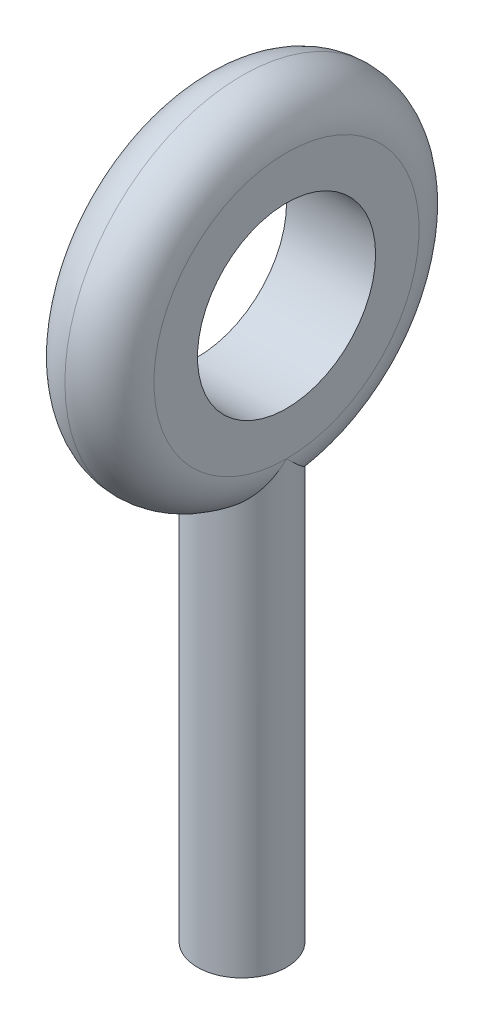
ISO-10303-21;
HEADER;
FILE_DESCRIPTION(('STEP AP214'),'2;1');
FILE_NAME('part.step','',(''),(''),'','','');
FILE_SCHEMA(('AUTOMOTIVE_DESIGN { 1 0 10303 214 1 1 1 1 }'));
ENDSEC;
DATA;
#1=APPLICATION_CONTEXT('core data for automotive mechanical design processes');
#2=APPLICATION_PROTOCOL_DEFINITION('international standard','automotive_design',2000,#1);
#3=PRODUCT_CONTEXT('',#1,'mechanical');
#4=PRODUCT('Part','Part','',(#3));
#5=PRODUCT_RELATED_PRODUCT_CATEGORY('part','',(#4));
#6=PRODUCT_DEFINITION_FORMATION('','',#4);
#7=PRODUCT_DEFINITION_CONTEXT('part definition',#1,'design');
#8=PRODUCT_DEFINITION('design','',#6,#7);
#9=PRODUCT_DEFINITION_SHAPE('','',#8);
#10=(LENGTH_UNIT() NAMED_UNIT(*) SI_UNIT(.MILLI.,.METRE.));
#11=(NAMED_UNIT(*) PLANE_ANGLE_UNIT() SI_UNIT($,.RADIAN.));
#12=(NAMED_UNIT(*) SI_UNIT($,.STERADIAN.) SOLID_ANGLE_UNIT());
#13=UNCERTAINTY_MEASURE_WITH_UNIT(LENGTH_MEASURE(1.E-05),#10,'distance_accuracy_value','');
#14=(GEOMETRIC_REPRESENTATION_CONTEXT(3) GLOBAL_UNCERTAINTY_ASSIGNED_CONTEXT((#13)) GLOBAL_UNIT_ASSIGNED_CONTEXT((#10,
#11,#12)) REPRESENTATION_CONTEXT('',''));
#15=CARTESIAN_POINT('',(0.,0.,0.));
#16=DIRECTION('',(0.,0.,1.));
#17=DIRECTION('',(1.,0.,0.));
#18=AXIS2_PLACEMENT_3D('',#15,#16,#17);
#19=CARTESIAN_POINT('',(3.175,-66.2523069570991,0.));
#20=DIRECTION('',(0.,1.,0.));
#21=DIRECTION('',(0.,0.,1.));
#22=AXIS2_PLACEMENT_3D('',#19,#20,#21);
#23=CYLINDRICAL_SURFACE('',#22,3.175);
#24=CARTESIAN_POINT('',(3.175,-12.2203304017109,3.175));
#25=CARTESIAN_POINT('',(3.25058717877362,-12.2203401520479,3.17501546389478));
#26=CARTESIAN_POINT('',(3.32616511915467,-12.2182431327259,3.17230120144131));
#27=CARTESIAN_POINT('',(3.47667643630509,-12.2099107567217,3.16153133110369));
#28=CARTESIAN_POINT('',(3.55161009033232,-12.2036772807421,3.15347815064083));
#29=CARTESIAN_POINT('',(3.69986312826365,-12.1871930320757,3.13220766395765));
#30=CARTESIAN_POINT('',(3.77318917197463,-12.1769647931453,3.11901932551284));
#31=CARTESIAN_POINT('',(3.91810714464931,-12.1526359234494,3.08770478565967));
#32=CARTESIAN_POINT('',(3.98969895719154,-12.1385350334868,3.06957825373793));
#33=CARTESIAN_POINT('',(4.20092733208115,-12.0907153354785,3.00824057276393));
#34=CARTESIAN_POINT('',(4.33736776169311,-12.051439539428,2.95801934192664));
#35=CARTESIAN_POINT('',(4.59851726014337,-11.9597989942898,2.84160985498486));
#36=CARTESIAN_POINT('',(4.72321279246199,-11.9074193905445,2.77540348089231));
#37=CARTESIAN_POINT('',(4.96660021044291,-11.7877430096744,2.62535814323807));
#38=CARTESIAN_POINT('',(5.084395182898,-11.7197053605964,2.54066107273756));
#39=CARTESIAN_POINT('',(5.30361244004525,-11.5731433082763,2.3600525972756));
#40=CARTESIAN_POINT('',(5.40502754858314,-11.4946143360787,2.26413630863961));
#41=CARTESIAN_POINT('',(5.63611071797704,-11.2891484066768,2.01605137987444));
#42=CARTESIAN_POINT('',(5.75598139164765,-11.1570658669725,1.85897697258496));
#43=CARTESIAN_POINT('',(5.96107985253833,-10.8789298892148,1.5347163236911));
#44=CARTESIAN_POINT('',(6.04622595753829,-10.7328444970927,1.36750729072541));
#45=CARTESIAN_POINT('',(6.19568207391777,-10.405311267525,1.00079433532972));
#46=CARTESIAN_POINT('',(6.25412977153179,-10.222034273568,0.800564308557489));
#47=CARTESIAN_POINT('',(6.33100184410796,-9.84642255570457,0.401780864382179));
#48=CARTESIAN_POINT('',(6.34950000010262,-9.654105200682,0.203225031998789));
#49=CARTESIAN_POINT('',(6.34999666457812,-9.45636032807791,0.00531296478064225));
#50=CARTESIAN_POINT('',(6.34999999772981,-9.4537046565621,0.0026561733122218));
#51=CARTESIAN_POINT('',(6.35,-9.45104847634363,0.));
#52=B_SPLINE_CURVE_WITH_KNOTS('',3,(#24,#25,#26,#27,#28,#29,#30,#31,#32,#33,#34,#35,#36,#37,#38,
#39,#40,#41,#42,#43,#44,#45,#46,#47,#48,#49,#50,#51),.UNSPECIFIED.,.F.,.F.,(4,2,2,2,2,2,2,2,2,2,
2,2,2,4),(0.,0.226668473055774,0.453233958413536,0.678539468695532,0.903860062384818,
1.3534441832624,1.80354028684649,2.28248200752316,2.76163299068898,3.47072626153887,
4.18147803519401,5.01104138546582,5.83907133719956,5.85034076955983),.UNSPECIFIED.);
#53=CARTESIAN_POINT('',(6.35,-9.45104847634363,0.));
#54=VERTEX_POINT('',#53);
#55=CARTESIAN_POINT('',(3.175,-12.2203304017109,3.175));
#56=VERTEX_POINT('',#55);
#57=EDGE_CURVE('E80',#54,#56,#52,.F.);
#58=ORIENTED_EDGE('',*,*,#57,.T.);
#59=CARTESIAN_POINT('',(3.175,-12.2203304017109,3.175));
#60=CARTESIAN_POINT('',(3.09941282122638,-12.2203401520479,3.17501546389478));
#61=CARTESIAN_POINT('',(3.02383488084533,-12.2182431327259,3.17230120144131));
#62=CARTESIAN_POINT('',(2.87332356369491,-12.2099107567217,3.16153133110369));
#63=CARTESIAN_POINT('',(2.79838990966768,-12.2036772807421,3.15347815064083));
#64=CARTESIAN_POINT('',(2.65013687173635,-12.1871930320757,3.13220766395765));
#65=CARTESIAN_POINT('',(2.57681082802537,-12.1769647931453,3.11901932551284));
#66=CARTESIAN_POINT('',(2.43189285535069,-12.1526359234494,3.08770478565967));
#67=CARTESIAN_POINT('',(2.36030104280846,-12.1385350334868,3.06957825373793));
#68=CARTESIAN_POINT('',(2.14907266791885,-12.0907153354785,3.00824057276393));
#69=CARTESIAN_POINT('',(2.01263223830689,-12.051439539428,2.95801934192664));
#70=CARTESIAN_POINT('',(1.75148273985663,-11.9597989942898,2.84160985498486));
#71=CARTESIAN_POINT('',(1.62678720753801,-11.9074193905445,2.77540348089231));
#72=CARTESIAN_POINT('',(1.38339978955709,-11.7877430096744,2.62535814323807));
#73=CARTESIAN_POINT('',(1.265604817102,-11.7197053605964,2.54066107273756));
#74=CARTESIAN_POINT('',(1.04638755995475,-11.5731433082763,2.3600525972756));
#75=CARTESIAN_POINT('',(0.944972451416861,-11.4946143360787,2.26413630863961));
#76=CARTESIAN_POINT('',(0.713889282022964,-11.2891484066768,2.01605137987444));
#77=CARTESIAN_POINT('',(0.594018608352354,-11.1570658669725,1.85897697258496));
#78=CARTESIAN_POINT('',(0.388920147461668,-10.8789298892148,1.5347163236911));
#79=CARTESIAN_POINT('',(0.303774042461712,-10.7328444970927,1.36750729072541));
#80=CARTESIAN_POINT('',(0.154317926082227,-10.405311267525,1.00079433532972));
#81=CARTESIAN_POINT('',(0.095870228468201,-10.222034273568,0.800564308557488));
#82=CARTESIAN_POINT('',(0.0189981558920475,-9.84642255570457,0.40178086438218));
#83=CARTESIAN_POINT('',(0.000499999897405677,-9.65410520068199,0.203225031998791));
#84=CARTESIAN_POINT('',(3.33542188197324E-06,-9.45636032807791,0.00531296478064122));
#85=CARTESIAN_POINT('',(2.27019350190972E-09,-9.4537046565621,0.00265617331222129));
#86=CARTESIAN_POINT('',(0.,-9.45104847634363,0.));
#87=B_SPLINE_CURVE_WITH_KNOTS('',3,(#59,#60,#61,#62,#63,#64,#65,#66,#67,#68,#69,#70,#71,#72,#73,
#74,#75,#76,#77,#78,#79,#80,#81,#82,#83,#84,#85,#86),.UNSPECIFIED.,.F.,.F.,(4,2,2,2,2,2,2,2,2,2,
2,2,2,4),(0.,0.226668473055774,0.453233958413536,0.678539468695532,0.903860062384818,
1.3534441832624,1.80354028684649,2.28248200752316,2.76163299068898,3.47072626153887,
4.18147803519401,5.01104138546581,5.83907133719957,5.85034076955983),.UNSPECIFIED.);
#88=CARTESIAN_POINT('',(0.,-9.45104847634363,0.));
#89=VERTEX_POINT('',#88);
#90=EDGE_CURVE('E11',#56,#89,#87,.T.);
#91=ORIENTED_EDGE('',*,*,#90,.T.);
#92=CARTESIAN_POINT('',(3.175,-12.2203304017109,-3.175));
#93=CARTESIAN_POINT('',(3.09941282122638,-12.2203401520479,-3.17501546389478));
#94=CARTESIAN_POINT('',(3.02383488084533,-12.2182431327259,-3.17230120144131));
#95=CARTESIAN_POINT('',(2.87332356369491,-12.2099107567217,-3.16153133110369));
#96=CARTESIAN_POINT('',(2.79838990966768,-12.2036772807421,-3.15347815064083));
#97=CARTESIAN_POINT('',(2.65013687173635,-12.1871930320757,-3.13220766395765));
#98=CARTESIAN_POINT('',(2.57681082802537,-12.1769647931454,-3.11901932551284));
#99=CARTESIAN_POINT('',(2.43189285535069,-12.1526359234495,-3.08770478565967));
#100=CARTESIAN_POINT('',(2.36030104280846,-12.1385350334868,-3.06957825373793));
#101=CARTESIAN_POINT('',(2.14907266791885,-12.0907153354785,-3.00824057276393));
#102=CARTESIAN_POINT('',(2.01263223830689,-12.051439539428,-2.95801934192664));
#103=CARTESIAN_POINT('',(1.75148273985663,-11.9597989942898,-2.84160985498486));
#104=CARTESIAN_POINT('',(1.62678720753801,-11.9074193905445,-2.77540348089231));
#105=CARTESIAN_POINT('',(1.3833997895571,-11.7877430096744,-2.62535814323807));
#106=CARTESIAN_POINT('',(1.265604817102,-11.7197053605964,-2.54066107273756));
#107=CARTESIAN_POINT('',(1.04638755995475,-11.5731433082763,-2.3600525972756));
#108=CARTESIAN_POINT('',(0.944972451416862,-11.4946143360787,-2.26413630863961));
#109=CARTESIAN_POINT('',(0.713889282022964,-11.2891484066768,-2.01605137987444));
#110=CARTESIAN_POINT('',(0.594018608352355,-11.1570658669725,-1.85897697258496));
#111=CARTESIAN_POINT('',(0.388920147461668,-10.8789298892148,-1.5347163236911));
#112=CARTESIAN_POINT('',(0.303774042461713,-10.7328444970927,-1.36750729072541));
#113=CARTESIAN_POINT('',(0.154317926082228,-10.405311267525,-1.00079433532972));
#114=CARTESIAN_POINT('',(0.0958702284682026,-10.222034273568,-0.800564308557489));
#115=CARTESIAN_POINT('',(0.0189981558920467,-9.84642255570457,-0.401780864382183));
#116=CARTESIAN_POINT('',(0.000499999897401517,-9.65410520068199,-0.203225031998796));
#117=CARTESIAN_POINT('',(3.33542188185887E-06,-9.45636032807791,-0.00531296478064255));
#118=CARTESIAN_POINT('',(2.27019344323859E-09,-9.4537046565621,-0.00265617331222195));
#119=CARTESIAN_POINT('',(0.,-9.45104847634363,0.));
#120=B_SPLINE_CURVE_WITH_KNOTS('',3,(#92,#93,#94,#95,#96,#97,#98,#99,#100,#101,#102,#103,#104,
#105,#106,#107,#108,#109,#110,#111,#112,#113,#114,#115,#116,#117,#118,#119),.UNSPECIFIED.,.F.,
.F.,(4,2,2,2,2,2,2,2,2,2,2,2,2,4),(0.,0.226668473055774,0.453233958413535,0.678539468695532,
0.903860062384818,1.3534441832624,1.80354028684649,2.28248200752316,2.76163299068898,
3.47072626153887,4.18147803519401,5.01104138546581,5.83907133719956,5.85034076955983),.UNSPECIFIED.);
#121=CARTESIAN_POINT('',(3.175,-12.2203304017109,-3.175));
#122=VERTEX_POINT('',#121);
#123=EDGE_CURVE('E56',#89,#122,#120,.F.);
#124=ORIENTED_EDGE('',*,*,#123,.T.);
#125=CARTESIAN_POINT('',(3.175,-12.2203304017109,-3.175));
#126=CARTESIAN_POINT('',(3.25058717877362,-12.2203401520479,-3.17501546389478));
#127=CARTESIAN_POINT('',(3.32616511915467,-12.2182431327259,-3.17230120144131));
#128=CARTESIAN_POINT('',(3.47667643630509,-12.2099107567217,-3.16153133110369));
#129=CARTESIAN_POINT('',(3.55161009033232,-12.2036772807421,-3.15347815064083));
#130=CARTESIAN_POINT('',(3.69986312826365,-12.1871930320757,-3.13220766395765));
#131=CARTESIAN_POINT('',(3.77318917197463,-12.1769647931453,-3.11901932551284));
#132=CARTESIAN_POINT('',(3.91810714464931,-12.1526359234494,-3.08770478565967));
#133=CARTESIAN_POINT('',(3.98969895719154,-12.1385350334868,-3.06957825373793));
#134=CARTESIAN_POINT('',(4.20092733208115,-12.0907153354785,-3.00824057276393));
#135=CARTESIAN_POINT('',(4.33736776169311,-12.051439539428,-2.95801934192664));
#136=CARTESIAN_POINT('',(4.59851726014337,-11.9597989942898,-2.84160985498486));
#137=CARTESIAN_POINT('',(4.72321279246199,-11.9074193905445,-2.77540348089231));
#138=CARTESIAN_POINT('',(4.96660021044291,-11.7877430096744,-2.62535814323807));
#139=CARTESIAN_POINT('',(5.084395182898,-11.7197053605964,-2.54066107273756));
#140=CARTESIAN_POINT('',(5.30361244004525,-11.5731433082763,-2.3600525972756));
#141=CARTESIAN_POINT('',(5.40502754858314,-11.4946143360787,-2.26413630863961));
#142=CARTESIAN_POINT('',(5.63611071797704,-11.2891484066768,-2.01605137987444));
#143=CARTESIAN_POINT('',(5.75598139164765,-11.1570658669725,-1.85897697258496));
#144=CARTESIAN_POINT('',(5.96107985253833,-10.8789298892148,-1.5347163236911));
#145=CARTESIAN_POINT('',(6.04622595753829,-10.7328444970927,-1.36750729072541));
#146=CARTESIAN_POINT('',(6.19568207391777,-10.405311267525,-1.00079433532972));
#147=CARTESIAN_POINT('',(6.25412977153179,-10.222034273568,-0.800564308557489));
#148=CARTESIAN_POINT('',(6.33100184410796,-9.84642255570457,-0.401780864382179));
#149=CARTESIAN_POINT('',(6.34950000010262,-9.654105200682,-0.203225031998789));
#150=CARTESIAN_POINT('',(6.34999666457812,-9.45636032807791,-0.00531296478064225));
#151=CARTESIAN_POINT('',(6.34999999772981,-9.4537046565621,-0.0026561733122218));
#152=CARTESIAN_POINT('',(6.35,-9.45104847634363,0.));
#153=B_SPLINE_CURVE_WITH_KNOTS('',3,(#125,#126,#127,#128,#129,#130,#131,#132,#133,#134,#135,
#136,#137,#138,#139,#140,#141,#142,#143,#144,#145,#146,#147,#148,#149,#150,#151,#152),
.UNSPECIFIED.,.F.,.F.,(4,2,2,2,2,2,2,2,2,2,2,2,2,4),(0.,0.226668473055774,0.453233958413536,
0.678539468695532,0.903860062384818,1.3534441832624,1.80354028684649,2.28248200752316,
2.76163299068898,3.47072626153887,4.18147803519401,5.01104138546582,5.83907133719956,
5.85034076955983),.UNSPECIFIED.);
#154=EDGE_CURVE('E77',#122,#54,#153,.T.);
#155=ORIENTED_EDGE('',*,*,#154,.T.);
#156=EDGE_LOOP('',(#58,#91,#124,#155));
#157=FACE_BOUND('',#156,.T.);
#158=CARTESIAN_POINT('',(3.175,-40.8523069570991,0.));
#159=DIRECTION('',(0.,-1.,0.));
#160=DIRECTION('',(0.,0.,-1.));
#161=AXIS2_PLACEMENT_3D('',#158,#159,#160);
#162=CIRCLE('',#161,3.175);
#163=CARTESIAN_POINT('',(3.175,-40.8523069570991,-3.175));
#164=VERTEX_POINT('',#163);
#165=EDGE_CURVE('E128',#164,#164,#162,.T.);
#166=ORIENTED_EDGE('',*,*,#165,.F.);
#167=EDGE_LOOP('',(#166));
#168=FACE_BOUND('',#167,.T.);
#169=ADVANCED_FACE('F45',(#157,#168),#23,.T.);
#170=CARTESIAN_POINT('',(6.35,0.,0.));
#171=DIRECTION('',(1.,0.,0.));
#172=DIRECTION('',(0.,0.,-1.));
#173=AXIS2_PLACEMENT_3D('',#170,#171,#172);
#174=PLANE('',#173);
#175=CARTESIAN_POINT('',(6.35,0.,0.));
#176=DIRECTION('',(1.,0.,0.));
#177=DIRECTION('',(0.,0.,-1.));
#178=AXIS2_PLACEMENT_3D('',#175,#176,#177);
#179=CIRCLE('',#178,9.45104847634363);
#180=EDGE_CURVE('E116',#54,#54,#179,.T.);
#181=ORIENTED_EDGE('',*,*,#180,.T.);
#182=EDGE_LOOP('',(#181));
#183=FACE_BOUND('',#182,.T.);
#184=CARTESIAN_POINT('',(6.35,0.,0.));
#185=DIRECTION('',(1.,0.,0.));
#186=DIRECTION('',(0.,0.,-1.));
#187=AXIS2_PLACEMENT_3D('',#184,#185,#186);
#188=CIRCLE('',#187,6.35);
#189=CARTESIAN_POINT('',(6.35,0.,-6.35));
#190=VERTEX_POINT('',#189);
#191=EDGE_CURVE('E120',#190,#190,#188,.T.);
#192=ORIENTED_EDGE('',*,*,#191,.F.);
#193=EDGE_LOOP('',(#192));
#194=FACE_BOUND('',#193,.T.);
#195=ADVANCED_FACE('F99',(#183,#194),#174,.T.);
#196=CARTESIAN_POINT('',(0.,0.,0.));
#197=DIRECTION('',(1.,0.,0.));
#198=DIRECTION('',(0.,0.,-1.));
#199=AXIS2_PLACEMENT_3D('',#196,#197,#198);
#200=PLANE('',#199);
#201=CARTESIAN_POINT('',(0.,0.,0.));
#202=DIRECTION('',(1.,0.,0.));
#203=DIRECTION('',(0.,0.,-1.));
#204=AXIS2_PLACEMENT_3D('',#201,#202,#203);
#205=CIRCLE('',#204,9.45104847634363);
#206=EDGE_CURVE('E75',#89,#89,#205,.F.);
#207=ORIENTED_EDGE('',*,*,#206,.T.);
#208=EDGE_LOOP('',(#207));
#209=FACE_BOUND('',#208,.T.);
#210=CARTESIAN_POINT('',(0.,0.,0.));
#211=DIRECTION('',(1.,0.,0.));
#212=DIRECTION('',(0.,0.,-1.));
#213=AXIS2_PLACEMENT_3D('',#210,#211,#212);
#214=CIRCLE('',#213,6.35);
#215=CARTESIAN_POINT('',(0.,0.,-6.35));
#216=VERTEX_POINT('',#215);
#217=EDGE_CURVE('E124',#216,#216,#214,.T.);
#218=ORIENTED_EDGE('',*,*,#217,.T.);
#219=EDGE_LOOP('',(#218));
#220=FACE_BOUND('',#219,.T.);
#221=ADVANCED_FACE('F142',(#209,#220),#200,.F.);
#222=CARTESIAN_POINT('',(6.35,0.,0.));
#223=DIRECTION('',(-1.,0.,0.));
#224=DIRECTION('',(0.,0.,1.));
#225=AXIS2_PLACEMENT_3D('',#222,#223,#224);
#226=CYLINDRICAL_SURFACE('',#225,6.35);
#227=ORIENTED_EDGE('',*,*,#191,.T.);
#228=EDGE_LOOP('',(#227));
#229=FACE_BOUND('',#228,.T.);
#230=ORIENTED_EDGE('',*,*,#217,.F.);
#231=EDGE_LOOP('',(#230));
#232=FACE_BOUND('',#231,.T.);
#233=ADVANCED_FACE('F100',(#229,#232),#226,.F.);
#234=CARTESIAN_POINT('',(3.175,-40.8523069570991,0.));
#235=DIRECTION('',(0.,-1.,0.));
#236=DIRECTION('',(0.,0.,-1.));
#237=AXIS2_PLACEMENT_3D('',#234,#235,#236);
#238=PLANE('',#237);
#239=ORIENTED_EDGE('',*,*,#165,.T.);
#240=EDGE_LOOP('',(#239));
#241=FACE_BOUND('',#240,.T.);
#242=ADVANCED_FACE('F134',(#241),#238,.T.);
#243=CARTESIAN_POINT('',(3.175,0.,0.));
#244=DIRECTION('',(1.,0.,0.));
#245=DIRECTION('',(0.,0.,-1.));
#246=AXIS2_PLACEMENT_3D('',#243,#244,#245);
#247=TOROIDAL_SURFACE('',#246,9.45104847634363,3.175);
#248=CARTESIAN_POINT('',(3.175,0.,0.));
#249=DIRECTION('',(1.,0.,0.));
#250=DIRECTION('',(0.,0.,-1.));
#251=AXIS2_PLACEMENT_3D('',#248,#249,#250);
#252=CIRCLE('',#251,12.6260484763436);
#253=EDGE_CURVE('E50',#122,#56,#252,.T.);
#254=ORIENTED_EDGE('',*,*,#253,.F.);
#255=ORIENTED_EDGE('',*,*,#123,.F.);
#256=ORIENTED_EDGE('',*,*,#206,.F.);
#257=ORIENTED_EDGE('',*,*,#90,.F.);
#258=EDGE_LOOP('',(#254,#255,#256,#257));
#259=FACE_BOUND('',#258,.T.);
#260=ADVANCED_FACE('F47',(#259),#247,.T.);
#261=CARTESIAN_POINT('',(3.175,0.,0.));
#262=DIRECTION('',(1.,0.,0.));
#263=DIRECTION('',(0.,0.,-1.));
#264=AXIS2_PLACEMENT_3D('',#261,#262,#263);
#265=TOROIDAL_SURFACE('',#264,9.45104847634363,3.175);
#266=ORIENTED_EDGE('',*,*,#154,.F.);
#267=ORIENTED_EDGE('',*,*,#253,.T.);
#268=ORIENTED_EDGE('',*,*,#57,.F.);
#269=ORIENTED_EDGE('',*,*,#180,.F.);
#270=EDGE_LOOP('',(#266,#267,#268,#269));
#271=FACE_BOUND('',#270,.T.);
#272=ADVANCED_FACE('F102',(#271),#265,.T.);
#273=CLOSED_SHELL('',(#169,#195,#221,#233,#242,#260,#272));
#274=MANIFOLD_SOLID_BREP('B2',#273);
#275=ADVANCED_BREP_SHAPE_REPRESENTATION('',(#18,#274),#14);
#276=SHAPE_DEFINITION_REPRESENTATION(#9,#275);
ENDSEC;
END-ISO-10303-21;
